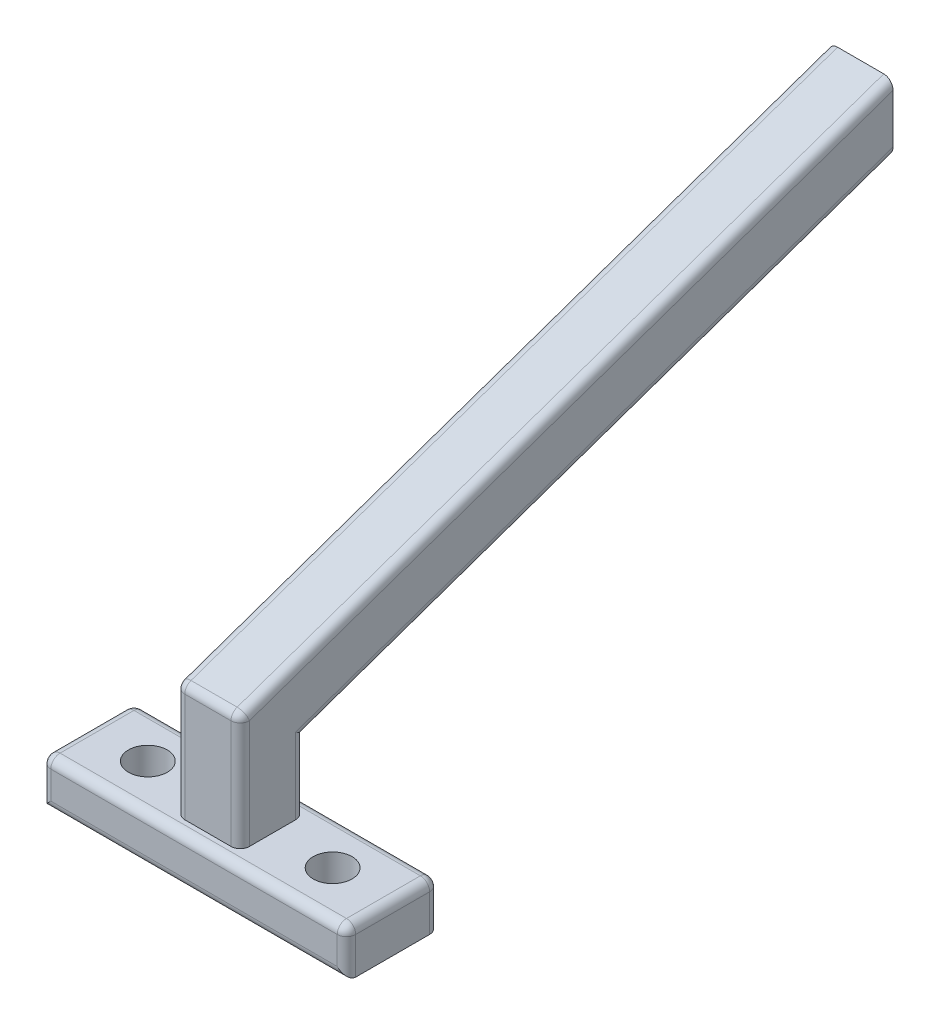
ISO-10303-21;
HEADER;
FILE_DESCRIPTION(('STEP AP214'),'2;1');
FILE_NAME('part.step','',(''),(''),'','','');
FILE_SCHEMA(('AUTOMOTIVE_DESIGN { 1 0 10303 214 1 1 1 1 }'));
ENDSEC;
DATA;
#1=APPLICATION_CONTEXT('core data for automotive mechanical design processes');
#2=APPLICATION_PROTOCOL_DEFINITION('international standard','automotive_design',2000,#1);
#3=PRODUCT_CONTEXT('',#1,'mechanical');
#4=PRODUCT('Part','Part','',(#3));
#5=PRODUCT_RELATED_PRODUCT_CATEGORY('part','',(#4));
#6=PRODUCT_DEFINITION_FORMATION('','',#4);
#7=PRODUCT_DEFINITION_CONTEXT('part definition',#1,'design');
#8=PRODUCT_DEFINITION('design','',#6,#7);
#9=PRODUCT_DEFINITION_SHAPE('','',#8);
#10=(LENGTH_UNIT() NAMED_UNIT(*) SI_UNIT(.MILLI.,.METRE.));
#11=(NAMED_UNIT(*) PLANE_ANGLE_UNIT() SI_UNIT($,.RADIAN.));
#12=(NAMED_UNIT(*) SI_UNIT($,.STERADIAN.) SOLID_ANGLE_UNIT());
#13=UNCERTAINTY_MEASURE_WITH_UNIT(LENGTH_MEASURE(1.E-05),#10,'distance_accuracy_value','');
#14=(GEOMETRIC_REPRESENTATION_CONTEXT(3) GLOBAL_UNCERTAINTY_ASSIGNED_CONTEXT((#13)) GLOBAL_UNIT_ASSIGNED_CONTEXT((#10,
#11,#12)) REPRESENTATION_CONTEXT('',''));
#15=CARTESIAN_POINT('',(0.,0.,0.));
#16=DIRECTION('',(0.,0.,1.));
#17=DIRECTION('',(1.,0.,0.));
#18=AXIS2_PLACEMENT_3D('',#15,#16,#17);
#19=CARTESIAN_POINT('',(7.,0.,10.));
#20=DIRECTION('',(0.,0.,-1.));
#21=DIRECTION('',(0.,1.,0.));
#22=AXIS2_PLACEMENT_3D('',#19,#20,#21);
#23=PLANE('',#22);
#24=DIRECTION('',(-1.,0.,0.));
#25=VECTOR('',#24,1.);
#26=CARTESIAN_POINT('',(20.,-4.,10.));
#27=LINE('',#26,#25);
#28=CARTESIAN_POINT('',(-12.,-4.,10.));
#29=VERTEX_POINT('',#28);
#30=CARTESIAN_POINT('',(19.,-4.,10.));
#31=VERTEX_POINT('',#30);
#32=EDGE_CURVE('E311',#29,#31,#27,.F.);
#33=ORIENTED_EDGE('',*,*,#32,.T.);
#34=DIRECTION('',(0.,-1.,0.));
#35=VECTOR('',#34,1.);
#36=CARTESIAN_POINT('',(19.,0.,10.));
#37=LINE('',#36,#35);
#38=CARTESIAN_POINT('',(19.,-1.,10.));
#39=VERTEX_POINT('',#38);
#40=EDGE_CURVE('E209',#31,#39,#37,.F.);
#41=ORIENTED_EDGE('',*,*,#40,.T.);
#42=DIRECTION('',(-1.,0.,0.));
#43=VECTOR('',#42,1.);
#44=CARTESIAN_POINT('',(7.,-1.,10.));
#45=LINE('',#44,#43);
#46=CARTESIAN_POINT('',(-12.,-1.,10.));
#47=VERTEX_POINT('',#46);
#48=EDGE_CURVE('E238',#39,#47,#45,.T.);
#49=ORIENTED_EDGE('',*,*,#48,.T.);
#50=DIRECTION('',(0.,-1.,0.));
#51=VECTOR('',#50,1.);
#52=CARTESIAN_POINT('',(-12.,-5.,10.));
#53=LINE('',#52,#51);
#54=EDGE_CURVE('E308',#47,#29,#53,.T.);
#55=ORIENTED_EDGE('',*,*,#54,.T.);
#56=EDGE_LOOP('',(#33,#41,#49,#55));
#57=FACE_BOUND('',#56,.T.);
#58=ADVANCED_FACE('F45',(#57),#23,.F.);
#59=CARTESIAN_POINT('',(7.,-5.,0.));
#60=DIRECTION('',(0.,-1.,0.));
#61=DIRECTION('',(0.,0.,-1.));
#62=AXIS2_PLACEMENT_3D('',#59,#60,#61);
#63=PLANE('',#62);
#64=CARTESIAN_POINT('',(-6.5,-5.,5.));
#65=DIRECTION('',(0.,-1.,0.));
#66=DIRECTION('',(0.,0.,-1.));
#67=AXIS2_PLACEMENT_3D('',#64,#65,#66);
#68=CIRCLE('',#67,2.1);
#69=CARTESIAN_POINT('',(-6.5,-5.,2.9));
#70=VERTEX_POINT('',#69);
#71=EDGE_CURVE('E300',#70,#70,#68,.T.);
#72=ORIENTED_EDGE('',*,*,#71,.F.);
#73=EDGE_LOOP('',(#72));
#74=FACE_BOUND('',#73,.T.);
#75=CARTESIAN_POINT('',(13.5,-5.,5.));
#76=DIRECTION('',(0.,-1.,0.));
#77=DIRECTION('',(0.,0.,-1.));
#78=AXIS2_PLACEMENT_3D('',#75,#76,#77);
#79=CIRCLE('',#78,2.1);
#80=CARTESIAN_POINT('',(13.5,-5.,2.9));
#81=VERTEX_POINT('',#80);
#82=EDGE_CURVE('E257',#81,#81,#79,.T.);
#83=ORIENTED_EDGE('',*,*,#82,.F.);
#84=EDGE_LOOP('',(#83));
#85=FACE_BOUND('',#84,.T.);
#86=DIRECTION('',(0.,0.,-1.));
#87=VECTOR('',#86,1.);
#88=CARTESIAN_POINT('',(20.,-5.,0.));
#89=LINE('',#88,#87);
#90=CARTESIAN_POINT('',(20.,-5.,9.));
#91=VERTEX_POINT('',#90);
#92=CARTESIAN_POINT('',(20.,-5.,1.));
#93=VERTEX_POINT('',#92);
#94=EDGE_CURVE('E232',#91,#93,#89,.T.);
#95=ORIENTED_EDGE('',*,*,#94,.F.);
#96=DIRECTION('',(-1.,0.,0.));
#97=VECTOR('',#96,1.);
#98=CARTESIAN_POINT('',(-13.,-5.,9.));
#99=LINE('',#98,#97);
#100=CARTESIAN_POINT('',(-13.,-5.,9.));
#101=VERTEX_POINT('',#100);
#102=EDGE_CURVE('E217',#91,#101,#99,.T.);
#103=ORIENTED_EDGE('',*,*,#102,.T.);
#104=DIRECTION('',(0.,0.,-1.));
#105=VECTOR('',#104,1.);
#106=CARTESIAN_POINT('',(-13.,-5.,0.));
#107=LINE('',#106,#105);
#108=CARTESIAN_POINT('',(-13.,-5.,1.));
#109=VERTEX_POINT('',#108);
#110=EDGE_CURVE('E246',#101,#109,#107,.T.);
#111=ORIENTED_EDGE('',*,*,#110,.T.);
#112=CARTESIAN_POINT('',(-12.,-5.,1.));
#113=DIRECTION('',(0.,-1.,0.));
#114=DIRECTION('',(0.,0.,-1.));
#115=AXIS2_PLACEMENT_3D('',#112,#113,#114);
#116=CIRCLE('',#115,1.);
#117=CARTESIAN_POINT('',(-12.,-5.,0.));
#118=VERTEX_POINT('',#117);
#119=EDGE_CURVE('E227',#109,#118,#116,.T.);
#120=ORIENTED_EDGE('',*,*,#119,.T.);
#121=DIRECTION('',(-1.,0.,0.));
#122=VECTOR('',#121,1.);
#123=CARTESIAN_POINT('',(7.,-5.,0.));
#124=LINE('',#123,#122);
#125=CARTESIAN_POINT('',(19.,-5.,0.));
#126=VERTEX_POINT('',#125);
#127=EDGE_CURVE('E291',#126,#118,#124,.T.);
#128=ORIENTED_EDGE('',*,*,#127,.F.);
#129=CARTESIAN_POINT('',(19.,-5.,1.));
#130=DIRECTION('',(0.,-1.,0.));
#131=DIRECTION('',(0.,0.,-1.));
#132=AXIS2_PLACEMENT_3D('',#129,#130,#131);
#133=CIRCLE('',#132,1.);
#134=EDGE_CURVE('E244',#126,#93,#133,.T.);
#135=ORIENTED_EDGE('',*,*,#134,.T.);
#136=EDGE_LOOP('',(#95,#103,#111,#120,#128,#135));
#137=FACE_BOUND('',#136,.T.);
#138=ADVANCED_FACE('F241',(#74,#85,#137),#63,.T.);
#139=CARTESIAN_POINT('',(7.,0.,0.));
#140=DIRECTION('',(0.,0.,-1.));
#141=DIRECTION('',(-1.,0.,0.));
#142=AXIS2_PLACEMENT_3D('',#139,#140,#141);
#143=PLANE('',#142);
#144=ORIENTED_EDGE('',*,*,#127,.T.);
#145=DIRECTION('',(0.,1.,0.));
#146=VECTOR('',#145,1.);
#147=CARTESIAN_POINT('',(-12.,0.,0.));
#148=LINE('',#147,#146);
#149=CARTESIAN_POINT('',(-12.,-1.,0.));
#150=VERTEX_POINT('',#149);
#151=EDGE_CURVE('E68',#118,#150,#148,.T.);
#152=ORIENTED_EDGE('',*,*,#151,.T.);
#153=DIRECTION('',(-1.,0.,0.));
#154=VECTOR('',#153,1.);
#155=CARTESIAN_POINT('',(20.,-1.,0.));
#156=LINE('',#155,#154);
#157=CARTESIAN_POINT('',(19.,-1.,0.));
#158=VERTEX_POINT('',#157);
#159=EDGE_CURVE('E63',#150,#158,#156,.F.);
#160=ORIENTED_EDGE('',*,*,#159,.T.);
#161=DIRECTION('',(0.,1.,0.));
#162=VECTOR('',#161,1.);
#163=CARTESIAN_POINT('',(19.,-5.,0.));
#164=LINE('',#163,#162);
#165=EDGE_CURVE('E412',#158,#126,#164,.F.);
#166=ORIENTED_EDGE('',*,*,#165,.T.);
#167=EDGE_LOOP('',(#144,#152,#160,#166));
#168=FACE_BOUND('',#167,.T.);
#169=ADVANCED_FACE('F583',(#168),#143,.T.);
#170=CARTESIAN_POINT('',(7.,0.,0.));
#171=DIRECTION('',(0.,-1.,0.));
#172=DIRECTION('',(0.,0.,-1.));
#173=AXIS2_PLACEMENT_3D('',#170,#171,#172);
#174=PLANE('',#173);
#175=DIRECTION('',(0.,0.,1.));
#176=VECTOR('',#175,1.);
#177=CARTESIAN_POINT('',(-12.,0.,10.));
#178=LINE('',#177,#176);
#179=CARTESIAN_POINT('',(-12.,0.,1.));
#180=VERTEX_POINT('',#179);
#181=CARTESIAN_POINT('',(-12.,0.,9.));
#182=VERTEX_POINT('',#181);
#183=EDGE_CURVE('E334',#180,#182,#178,.T.);
#184=ORIENTED_EDGE('',*,*,#183,.T.);
#185=DIRECTION('',(-1.,0.,0.));
#186=VECTOR('',#185,1.);
#187=CARTESIAN_POINT('',(7.,0.,9.));
#188=LINE('',#187,#186);
#189=CARTESIAN_POINT('',(19.,0.,9.));
#190=VERTEX_POINT('',#189);
#191=EDGE_CURVE('E337',#182,#190,#188,.F.);
#192=ORIENTED_EDGE('',*,*,#191,.T.);
#193=DIRECTION('',(0.,0.,1.));
#194=VECTOR('',#193,1.);
#195=CARTESIAN_POINT('',(19.,0.,0.));
#196=LINE('',#195,#194);
#197=CARTESIAN_POINT('',(19.,0.,1.));
#198=VERTEX_POINT('',#197);
#199=EDGE_CURVE('E328',#190,#198,#196,.F.);
#200=ORIENTED_EDGE('',*,*,#199,.T.);
#201=DIRECTION('',(-1.,0.,0.));
#202=VECTOR('',#201,1.);
#203=CARTESIAN_POINT('',(-13.,0.,1.));
#204=LINE('',#203,#202);
#205=EDGE_CURVE('E331',#198,#180,#204,.T.);
#206=ORIENTED_EDGE('',*,*,#205,.T.);
#207=EDGE_LOOP('',(#184,#192,#200,#206));
#208=FACE_BOUND('',#207,.T.);
#209=CARTESIAN_POINT('',(-6.5,0.,5.));
#210=DIRECTION('',(0.,-1.,0.));
#211=DIRECTION('',(0.,0.,-1.));
#212=AXIS2_PLACEMENT_3D('',#209,#210,#211);
#213=CIRCLE('',#212,2.1);
#214=CARTESIAN_POINT('',(-6.5,0.,2.9));
#215=VERTEX_POINT('',#214);
#216=EDGE_CURVE('E247',#215,#215,#213,.T.);
#217=ORIENTED_EDGE('',*,*,#216,.T.);
#218=EDGE_LOOP('',(#217));
#219=FACE_BOUND('',#218,.T.);
#220=CARTESIAN_POINT('',(13.5,0.,5.));
#221=DIRECTION('',(0.,-1.,0.));
#222=DIRECTION('',(0.,0.,-1.));
#223=AXIS2_PLACEMENT_3D('',#220,#221,#222);
#224=CIRCLE('',#223,2.1);
#225=CARTESIAN_POINT('',(13.5,0.,2.9));
#226=VERTEX_POINT('',#225);
#227=EDGE_CURVE('E254',#226,#226,#224,.T.);
#228=ORIENTED_EDGE('',*,*,#227,.T.);
#229=EDGE_LOOP('',(#228));
#230=FACE_BOUND('',#229,.T.);
#231=DIRECTION('',(-1.,0.,0.));
#232=VECTOR('',#231,1.);
#233=CARTESIAN_POINT('',(7.,0.,1.5));
#234=LINE('',#233,#232);
#235=CARTESIAN_POINT('',(6.,0.,1.5));
#236=VERTEX_POINT('',#235);
#237=CARTESIAN_POINT('',(1.,0.,1.5));
#238=VERTEX_POINT('',#237);
#239=EDGE_CURVE('E287',#236,#238,#234,.T.);
#240=ORIENTED_EDGE('',*,*,#239,.F.);
#241=CARTESIAN_POINT('',(6.,0.,2.5));
#242=DIRECTION('',(0.,-1.,0.));
#243=DIRECTION('',(0.,0.,-1.));
#244=AXIS2_PLACEMENT_3D('',#241,#242,#243);
#245=CIRCLE('',#244,1.);
#246=CARTESIAN_POINT('',(7.,0.,2.5));
#247=VERTEX_POINT('',#246);
#248=EDGE_CURVE('E417',#236,#247,#245,.T.);
#249=ORIENTED_EDGE('',*,*,#248,.T.);
#250=DIRECTION('',(0.,0.,1.));
#251=VECTOR('',#250,1.);
#252=CARTESIAN_POINT('',(7.,0.,0.));
#253=LINE('',#252,#251);
#254=CARTESIAN_POINT('',(7.,0.,7.5));
#255=VERTEX_POINT('',#254);
#256=EDGE_CURVE('E251',#247,#255,#253,.T.);
#257=ORIENTED_EDGE('',*,*,#256,.T.);
#258=CARTESIAN_POINT('',(6.,0.,7.5));
#259=DIRECTION('',(0.,-1.,0.));
#260=DIRECTION('',(0.,0.,-1.));
#261=AXIS2_PLACEMENT_3D('',#258,#259,#260);
#262=CIRCLE('',#261,1.);
#263=CARTESIAN_POINT('',(6.,0.,8.5));
#264=VERTEX_POINT('',#263);
#265=EDGE_CURVE('E55',#255,#264,#262,.T.);
#266=ORIENTED_EDGE('',*,*,#265,.T.);
#267=DIRECTION('',(-1.,0.,0.));
#268=VECTOR('',#267,1.);
#269=CARTESIAN_POINT('',(7.,0.,8.5));
#270=LINE('',#269,#268);
#271=CARTESIAN_POINT('',(1.,0.,8.5));
#272=VERTEX_POINT('',#271);
#273=EDGE_CURVE('E268',#264,#272,#270,.T.);
#274=ORIENTED_EDGE('',*,*,#273,.T.);
#275=CARTESIAN_POINT('',(1.,0.,7.5));
#276=DIRECTION('',(0.,-1.,0.));
#277=DIRECTION('',(0.,0.,-1.));
#278=AXIS2_PLACEMENT_3D('',#275,#276,#277);
#279=CIRCLE('',#278,1.);
#280=CARTESIAN_POINT('',(0.,0.,7.5));
#281=VERTEX_POINT('',#280);
#282=EDGE_CURVE('E11',#272,#281,#279,.T.);
#283=ORIENTED_EDGE('',*,*,#282,.T.);
#284=DIRECTION('',(0.,0.,1.));
#285=VECTOR('',#284,1.);
#286=CARTESIAN_POINT('',(0.,0.,0.));
#287=LINE('',#286,#285);
#288=CARTESIAN_POINT('',(0.,0.,2.5));
#289=VERTEX_POINT('',#288);
#290=EDGE_CURVE('E294',#289,#281,#287,.T.);
#291=ORIENTED_EDGE('',*,*,#290,.F.);
#292=CARTESIAN_POINT('',(1.,0.,2.5));
#293=DIRECTION('',(0.,-1.,0.));
#294=DIRECTION('',(0.,0.,-1.));
#295=AXIS2_PLACEMENT_3D('',#292,#293,#294);
#296=CIRCLE('',#295,1.);
#297=EDGE_CURVE('E420',#289,#238,#296,.T.);
#298=ORIENTED_EDGE('',*,*,#297,.T.);
#299=EDGE_LOOP('',(#240,#249,#257,#266,#274,#283,#291,#298));
#300=FACE_BOUND('',#299,.T.);
#301=ADVANCED_FACE('F547',(#208,#219,#230,#300),#174,.F.);
#302=CARTESIAN_POINT('',(7.,0.,1.5));
#303=DIRECTION('',(0.,0.,1.));
#304=DIRECTION('',(1.,0.,0.));
#305=AXIS2_PLACEMENT_3D('',#302,#303,#304);
#306=PLANE('',#305);
#307=DIRECTION('',(-1.,0.,0.));
#308=VECTOR('',#307,1.);
#309=CARTESIAN_POINT('',(7.,7.51262313800513,1.5));
#310=LINE('',#309,#308);
#311=CARTESIAN_POINT('',(6.,7.51262313800513,1.5));
#312=VERTEX_POINT('',#311);
#313=CARTESIAN_POINT('',(1.,7.51262313800513,1.5));
#314=VERTEX_POINT('',#313);
#315=EDGE_CURVE('E283',#312,#314,#310,.T.);
#316=ORIENTED_EDGE('',*,*,#315,.F.);
#317=DIRECTION('',(0.,1.,0.));
#318=VECTOR('',#317,1.);
#319=CARTESIAN_POINT('',(6.,0.,1.5));
#320=LINE('',#319,#318);
#321=EDGE_CURVE('E357',#312,#236,#320,.F.);
#322=ORIENTED_EDGE('',*,*,#321,.T.);
#323=ORIENTED_EDGE('',*,*,#239,.T.);
#324=DIRECTION('',(0.,1.,0.));
#325=VECTOR('',#324,1.);
#326=CARTESIAN_POINT('',(1.,0.,1.5));
#327=LINE('',#326,#325);
#328=EDGE_CURVE('E354',#238,#314,#327,.T.);
#329=ORIENTED_EDGE('',*,*,#328,.T.);
#330=EDGE_LOOP('',(#316,#322,#323,#329));
#331=FACE_BOUND('',#330,.T.);
#332=ADVANCED_FACE('F575',(#331),#306,.F.);
#333=CARTESIAN_POINT('',(7.,7.51262313800513,1.5));
#334=DIRECTION('',(0.,0.944383403386701,0.328846449589701));
#335=DIRECTION('',(0.,-0.328846449589701,0.944383403386701));
#336=AXIS2_PLACEMENT_3D('',#333,#334,#335);
#337=PLANE('',#336);
#338=DIRECTION('',(-1.,0.,0.));
#339=VECTOR('',#338,1.);
#340=CARTESIAN_POINT('',(7.,29.6763719304156,-62.15));
#341=LINE('',#340,#339);
#342=CARTESIAN_POINT('',(6.,29.6763719304156,-62.15));
#343=VERTEX_POINT('',#342);
#344=CARTESIAN_POINT('',(1.,29.6763719304156,-62.15));
#345=VERTEX_POINT('',#344);
#346=EDGE_CURVE('E279',#343,#345,#341,.T.);
#347=ORIENTED_EDGE('',*,*,#346,.F.);
#348=DIRECTION('',(0.,0.328846449589701,-0.944383403386701));
#349=VECTOR('',#348,1.);
#350=CARTESIAN_POINT('',(6.,7.51262313800513,1.5));
#351=LINE('',#350,#349);
#352=EDGE_CURVE('E376',#343,#312,#351,.F.);
#353=ORIENTED_EDGE('',*,*,#352,.T.);
#354=ORIENTED_EDGE('',*,*,#315,.T.);
#355=DIRECTION('',(0.,0.328846449589701,-0.944383403386701));
#356=VECTOR('',#355,1.);
#357=CARTESIAN_POINT('',(1.,7.51262313800513,1.5));
#358=LINE('',#357,#356);
#359=EDGE_CURVE('E372',#314,#345,#358,.T.);
#360=ORIENTED_EDGE('',*,*,#359,.T.);
#361=EDGE_LOOP('',(#347,#353,#354,#360));
#362=FACE_BOUND('',#361,.T.);
#363=ADVANCED_FACE('F533',(#362),#337,.F.);
#364=CARTESIAN_POINT('',(7.,29.6763719304156,-62.15));
#365=DIRECTION('',(0.,0.,1.));
#366=DIRECTION('',(0.,-1.,0.));
#367=AXIS2_PLACEMENT_3D('',#364,#365,#366);
#368=PLANE('',#367);
#369=DIRECTION('',(0.,1.,0.));
#370=VECTOR('',#369,1.);
#371=CARTESIAN_POINT('',(7.,29.6763719304156,-62.15));
#372=LINE('',#371,#370);
#373=CARTESIAN_POINT('',(7.,30.7352638978241,-62.15));
#374=VERTEX_POINT('',#373);
#375=CARTESIAN_POINT('',(7.,36.0297237348661,-62.15));
#376=VERTEX_POINT('',#375);
#377=EDGE_CURVE('E264',#374,#376,#372,.T.);
#378=ORIENTED_EDGE('',*,*,#377,.F.);
#379=CARTESIAN_POINT('',(6.,30.7352638978241,-62.15));
#380=DIRECTION('',(0.,0.,1.));
#381=DIRECTION('',(0.,-1.,0.));
#382=AXIS2_PLACEMENT_3D('',#379,#380,#381);
#383=ELLIPSE('',#382,1.05889196740842,1.);
#384=EDGE_CURVE('E369',#374,#343,#383,.F.);
#385=ORIENTED_EDGE('',*,*,#384,.T.);
#386=ORIENTED_EDGE('',*,*,#346,.T.);
#387=CARTESIAN_POINT('',(1.,30.735263897824,-62.15));
#388=DIRECTION('',(0.,0.,1.));
#389=DIRECTION('',(0.,1.,0.));
#390=AXIS2_PLACEMENT_3D('',#387,#388,#389);
#391=ELLIPSE('',#390,1.05889196740842,1.);
#392=CARTESIAN_POINT('',(0.,30.7352638978241,-62.15));
#393=VERTEX_POINT('',#392);
#394=EDGE_CURVE('E360',#345,#393,#391,.F.);
#395=ORIENTED_EDGE('',*,*,#394,.T.);
#396=DIRECTION('',(0.,1.,0.));
#397=VECTOR('',#396,1.);
#398=CARTESIAN_POINT('',(0.,29.6763719304156,-62.15));
#399=LINE('',#398,#397);
#400=CARTESIAN_POINT('',(0.,36.0297237348661,-62.15));
#401=VERTEX_POINT('',#400);
#402=EDGE_CURVE('E263',#393,#401,#399,.T.);
#403=ORIENTED_EDGE('',*,*,#402,.T.);
#404=CARTESIAN_POINT('',(1.,36.0297237348661,-62.15));
#405=DIRECTION('',(0.,0.,1.));
#406=DIRECTION('',(0.,-1.,0.));
#407=AXIS2_PLACEMENT_3D('',#404,#405,#406);
#408=ELLIPSE('',#407,1.05889196740842,1.);
#409=CARTESIAN_POINT('',(1.,37.0886157022746,-62.15));
#410=VERTEX_POINT('',#409);
#411=EDGE_CURVE('E363',#401,#410,#408,.F.);
#412=ORIENTED_EDGE('',*,*,#411,.T.);
#413=DIRECTION('',(-1.,0.,0.));
#414=VECTOR('',#413,1.);
#415=CARTESIAN_POINT('',(7.,37.0886157022746,-62.15));
#416=LINE('',#415,#414);
#417=CARTESIAN_POINT('',(6.,37.0886157022746,-62.15));
#418=VERTEX_POINT('',#417);
#419=EDGE_CURVE('E275',#418,#410,#416,.T.);
#420=ORIENTED_EDGE('',*,*,#419,.F.);
#421=CARTESIAN_POINT('',(6.,36.0297237348661,-62.15));
#422=DIRECTION('',(0.,0.,1.));
#423=DIRECTION('',(0.,1.,0.));
#424=AXIS2_PLACEMENT_3D('',#421,#422,#423);
#425=ELLIPSE('',#424,1.05889196740842,1.);
#426=EDGE_CURVE('E366',#418,#376,#425,.F.);
#427=ORIENTED_EDGE('',*,*,#426,.T.);
#428=EDGE_LOOP('',(#378,#385,#386,#395,#403,#412,#420,#427));
#429=FACE_BOUND('',#428,.T.);
#430=ADVANCED_FACE('F526',(#429),#368,.F.);
#431=CARTESIAN_POINT('',(7.,12.4873768619949,8.5));
#432=DIRECTION('',(0.,0.944383403386701,0.328846449589701));
#433=DIRECTION('',(0.,-0.328846449589701,0.944383403386701));
#434=AXIS2_PLACEMENT_3D('',#431,#432,#433);
#435=PLANE('',#434);
#436=DIRECTION('',(-1.,0.,0.));
#437=VECTOR('',#436,1.);
#438=CARTESIAN_POINT('',(7.,12.7210811619545,7.8288464495897));
#439=LINE('',#438,#437);
#440=CARTESIAN_POINT('',(1.,12.7210811619545,7.8288464495897));
#441=VERTEX_POINT('',#440);
#442=CARTESIAN_POINT('',(6.,12.7210811619545,7.8288464495897));
#443=VERTEX_POINT('',#442);
#444=EDGE_CURVE('E379',#441,#443,#439,.F.);
#445=ORIENTED_EDGE('',*,*,#444,.T.);
#446=DIRECTION('',(0.,0.328846449589701,-0.944383403386701));
#447=VECTOR('',#446,1.);
#448=CARTESIAN_POINT('',(6.,12.4873768619949,8.5));
#449=LINE('',#448,#447);
#450=EDGE_CURVE('E385',#443,#418,#449,.T.);
#451=ORIENTED_EDGE('',*,*,#450,.T.);
#452=ORIENTED_EDGE('',*,*,#419,.T.);
#453=DIRECTION('',(0.,0.328846449589701,-0.944383403386701));
#454=VECTOR('',#453,1.);
#455=CARTESIAN_POINT('',(1.,12.4873768619949,8.5));
#456=LINE('',#455,#454);
#457=EDGE_CURVE('E382',#410,#441,#456,.F.);
#458=ORIENTED_EDGE('',*,*,#457,.T.);
#459=EDGE_LOOP('',(#445,#451,#452,#458));
#460=FACE_BOUND('',#459,.T.);
#461=ADVANCED_FACE('F512',(#460),#435,.T.);
#462=CARTESIAN_POINT('',(7.,0.,8.5));
#463=DIRECTION('',(0.,0.,1.));
#464=DIRECTION('',(1.,0.,0.));
#465=AXIS2_PLACEMENT_3D('',#462,#463,#464);
#466=PLANE('',#465);
#467=ORIENTED_EDGE('',*,*,#273,.F.);
#468=DIRECTION('',(0.,1.,0.));
#469=VECTOR('',#468,1.);
#470=CARTESIAN_POINT('',(6.,0.,8.5));
#471=LINE('',#470,#469);
#472=CARTESIAN_POINT('',(6.,11.7766977585678,8.5));
#473=VERTEX_POINT('',#472);
#474=EDGE_CURVE('E407',#264,#473,#471,.T.);
#475=ORIENTED_EDGE('',*,*,#474,.T.);
#476=DIRECTION('',(-1.,0.,0.));
#477=VECTOR('',#476,1.);
#478=CARTESIAN_POINT('',(7.,11.7766977585678,8.5));
#479=LINE('',#478,#477);
#480=CARTESIAN_POINT('',(1.,11.7766977585678,8.5));
#481=VERTEX_POINT('',#480);
#482=EDGE_CURVE('E404',#473,#481,#479,.T.);
#483=ORIENTED_EDGE('',*,*,#482,.T.);
#484=DIRECTION('',(0.,1.,0.));
#485=VECTOR('',#484,1.);
#486=CARTESIAN_POINT('',(1.,0.,8.5));
#487=LINE('',#486,#485);
#488=EDGE_CURVE('E401',#481,#272,#487,.F.);
#489=ORIENTED_EDGE('',*,*,#488,.T.);
#490=EDGE_LOOP('',(#467,#475,#483,#489));
#491=FACE_BOUND('',#490,.T.);
#492=ADVANCED_FACE('F552',(#491),#466,.T.);
#493=CARTESIAN_POINT('',(7.,0.,0.));
#494=DIRECTION('',(1.,0.,0.));
#495=DIRECTION('',(0.,0.,-1.));
#496=AXIS2_PLACEMENT_3D('',#493,#494,#495);
#497=PLANE('',#496);
#498=ORIENTED_EDGE('',*,*,#256,.F.);
#499=DIRECTION('',(0.,1.,0.));
#500=VECTOR('',#499,1.);
#501=CARTESIAN_POINT('',(7.,7.51262313800513,2.5));
#502=LINE('',#501,#500);
#503=CARTESIAN_POINT('',(7.,8.22330224143225,2.5));
#504=VERTEX_POINT('',#503);
#505=EDGE_CURVE('E350',#247,#504,#502,.T.);
#506=ORIENTED_EDGE('',*,*,#505,.T.);
#507=DIRECTION('',(0.,0.328846449589701,-0.944383403386701));
#508=VECTOR('',#507,1.);
#509=CARTESIAN_POINT('',(7.,30.6207553338023,-61.8211535504103));
#510=LINE('',#509,#508);
#511=EDGE_CURVE('E347',#504,#374,#510,.T.);
#512=ORIENTED_EDGE('',*,*,#511,.T.);
#513=ORIENTED_EDGE('',*,*,#377,.T.);
#514=DIRECTION('',(0.,0.328846449589701,-0.944383403386701));
#515=VECTOR('',#514,1.);
#516=CARTESIAN_POINT('',(7.,12.832344280665,4.46838735356457));
#517=LINE('',#516,#515);
#518=CARTESIAN_POINT('',(7.,11.7766977585678,7.5));
#519=VERTEX_POINT('',#518);
#520=EDGE_CURVE('E344',#376,#519,#517,.F.);
#521=ORIENTED_EDGE('',*,*,#520,.T.);
#522=DIRECTION('',(0.,1.,0.));
#523=VECTOR('',#522,1.);
#524=CARTESIAN_POINT('',(7.,0.,7.5));
#525=LINE('',#524,#523);
#526=EDGE_CURVE('E341',#519,#255,#525,.F.);
#527=ORIENTED_EDGE('',*,*,#526,.T.);
#528=EDGE_LOOP('',(#498,#506,#512,#513,#521,#527));
#529=FACE_BOUND('',#528,.T.);
#530=ADVANCED_FACE('F566',(#529),#497,.T.);
#531=CARTESIAN_POINT('',(0.,0.,0.));
#532=DIRECTION('',(1.,0.,0.));
#533=DIRECTION('',(0.,0.,-1.));
#534=AXIS2_PLACEMENT_3D('',#531,#532,#533);
#535=PLANE('',#534);
#536=ORIENTED_EDGE('',*,*,#402,.F.);
#537=DIRECTION('',(0.,0.328846449589701,-0.944383403386701));
#538=VECTOR('',#537,1.);
#539=CARTESIAN_POINT('',(0.,8.11042726373151,2.82415510561606));
#540=LINE('',#539,#538);
#541=CARTESIAN_POINT('',(0.,8.22330224143224,2.5));
#542=VERTEX_POINT('',#541);
#543=EDGE_CURVE('E398',#393,#542,#540,.F.);
#544=ORIENTED_EDGE('',*,*,#543,.T.);
#545=DIRECTION('',(0.,1.,0.));
#546=VECTOR('',#545,1.);
#547=CARTESIAN_POINT('',(0.,0.,2.5));
#548=LINE('',#547,#546);
#549=EDGE_CURVE('E395',#542,#289,#548,.F.);
#550=ORIENTED_EDGE('',*,*,#549,.T.);
#551=ORIENTED_EDGE('',*,*,#290,.T.);
#552=DIRECTION('',(0.,1.,0.));
#553=VECTOR('',#552,1.);
#554=CARTESIAN_POINT('',(0.,12.4873768619949,7.5));
#555=LINE('',#554,#553);
#556=CARTESIAN_POINT('',(0.,11.7766977585678,7.5));
#557=VERTEX_POINT('',#556);
#558=EDGE_CURVE('E389',#281,#557,#555,.T.);
#559=ORIENTED_EDGE('',*,*,#558,.T.);
#560=DIRECTION('',(0.,0.328846449589701,-0.944383403386701));
#561=VECTOR('',#560,1.);
#562=CARTESIAN_POINT('',(0.,36.1442322988879,-62.4788464495897));
#563=LINE('',#562,#561);
#564=EDGE_CURVE('E392',#557,#401,#563,.T.);
#565=ORIENTED_EDGE('',*,*,#564,.T.);
#566=EDGE_LOOP('',(#536,#544,#550,#551,#559,#565));
#567=FACE_BOUND('',#566,.T.);
#568=ADVANCED_FACE('F522',(#567),#535,.F.);
#569=CARTESIAN_POINT('',(-13.,0.,0.));
#570=DIRECTION('',(-1.,0.,0.));
#571=DIRECTION('',(0.,0.,1.));
#572=AXIS2_PLACEMENT_3D('',#569,#570,#571);
#573=PLANE('',#572);
#574=ORIENTED_EDGE('',*,*,#110,.F.);
#575=DIRECTION('',(0.,-1.,0.));
#576=VECTOR('',#575,1.);
#577=CARTESIAN_POINT('',(-13.,0.,9.));
#578=LINE('',#577,#576);
#579=CARTESIAN_POINT('',(-13.,-1.,9.));
#580=VERTEX_POINT('',#579);
#581=EDGE_CURVE('E325',#101,#580,#578,.F.);
#582=ORIENTED_EDGE('',*,*,#581,.T.);
#583=DIRECTION('',(0.,0.,1.));
#584=VECTOR('',#583,1.);
#585=CARTESIAN_POINT('',(-13.,-1.,0.));
#586=LINE('',#585,#584);
#587=CARTESIAN_POINT('',(-13.,-1.,1.));
#588=VERTEX_POINT('',#587);
#589=EDGE_CURVE('E322',#580,#588,#586,.F.);
#590=ORIENTED_EDGE('',*,*,#589,.T.);
#591=DIRECTION('',(0.,1.,0.));
#592=VECTOR('',#591,1.);
#593=CARTESIAN_POINT('',(-13.,0.,1.));
#594=LINE('',#593,#592);
#595=EDGE_CURVE('E226',#588,#109,#594,.F.);
#596=ORIENTED_EDGE('',*,*,#595,.T.);
#597=EDGE_LOOP('',(#574,#582,#590,#596));
#598=FACE_BOUND('',#597,.T.);
#599=ADVANCED_FACE('F788',(#598),#573,.T.);
#600=CARTESIAN_POINT('',(20.,0.,0.));
#601=DIRECTION('',(-1.,0.,0.));
#602=DIRECTION('',(0.,0.,1.));
#603=AXIS2_PLACEMENT_3D('',#600,#601,#602);
#604=PLANE('',#603);
#605=DIRECTION('',(0.,0.,1.));
#606=VECTOR('',#605,1.);
#607=CARTESIAN_POINT('',(20.,-1.,0.));
#608=LINE('',#607,#606);
#609=CARTESIAN_POINT('',(20.,-1.,1.));
#610=VERTEX_POINT('',#609);
#611=CARTESIAN_POINT('',(20.,-1.,9.));
#612=VERTEX_POINT('',#611);
#613=EDGE_CURVE('E235',#610,#612,#608,.T.);
#614=ORIENTED_EDGE('',*,*,#613,.T.);
#615=DIRECTION('',(0.,-1.,0.));
#616=VECTOR('',#615,1.);
#617=CARTESIAN_POINT('',(20.,0.,9.));
#618=LINE('',#617,#616);
#619=EDGE_CURVE('E207',#612,#91,#618,.T.);
#620=ORIENTED_EDGE('',*,*,#619,.T.);
#621=ORIENTED_EDGE('',*,*,#94,.T.);
#622=DIRECTION('',(0.,1.,0.));
#623=VECTOR('',#622,1.);
#624=CARTESIAN_POINT('',(20.,0.,1.));
#625=LINE('',#624,#623);
#626=EDGE_CURVE('E239',#93,#610,#625,.T.);
#627=ORIENTED_EDGE('',*,*,#626,.T.);
#628=EDGE_LOOP('',(#614,#620,#621,#627));
#629=FACE_BOUND('',#628,.T.);
#630=ADVANCED_FACE('F231',(#629),#604,.F.);
#631=CARTESIAN_POINT('',(13.5,37.0886157022746,5.));
#632=DIRECTION('',(0.,-1.,0.));
#633=DIRECTION('',(0.,0.,-1.));
#634=AXIS2_PLACEMENT_3D('',#631,#632,#633);
#635=CYLINDRICAL_SURFACE('',#634,2.1);
#636=ORIENTED_EDGE('',*,*,#82,.T.);
#637=EDGE_LOOP('',(#636));
#638=FACE_BOUND('',#637,.T.);
#639=ORIENTED_EDGE('',*,*,#227,.F.);
#640=EDGE_LOOP('',(#639));
#641=FACE_BOUND('',#640,.T.);
#642=ADVANCED_FACE('F787',(#638,#641),#635,.F.);
#643=CARTESIAN_POINT('',(-6.5,37.0886157022746,5.));
#644=DIRECTION('',(0.,-1.,0.));
#645=DIRECTION('',(0.,0.,-1.));
#646=AXIS2_PLACEMENT_3D('',#643,#644,#645);
#647=CYLINDRICAL_SURFACE('',#646,2.1);
#648=ORIENTED_EDGE('',*,*,#71,.T.);
#649=EDGE_LOOP('',(#648));
#650=FACE_BOUND('',#649,.T.);
#651=ORIENTED_EDGE('',*,*,#216,.F.);
#652=EDGE_LOOP('',(#651));
#653=FACE_BOUND('',#652,.T.);
#654=ADVANCED_FACE('F644',(#650,#653),#647,.F.);
#655=CARTESIAN_POINT('',(-12.,0.,1.));
#656=DIRECTION('',(0.,1.,0.));
#657=DIRECTION('',(0.,0.,1.));
#658=AXIS2_PLACEMENT_3D('',#655,#656,#657);
#659=CYLINDRICAL_SURFACE('',#658,1.);
#660=CARTESIAN_POINT('',(-12.,-1.,1.));
#661=DIRECTION('',(0.,1.,0.));
#662=DIRECTION('',(0.,0.,1.));
#663=AXIS2_PLACEMENT_3D('',#660,#661,#662);
#664=CIRCLE('',#663,1.);
#665=EDGE_CURVE('E468',#150,#588,#664,.T.);
#666=ORIENTED_EDGE('',*,*,#665,.F.);
#667=ORIENTED_EDGE('',*,*,#151,.F.);
#668=ORIENTED_EDGE('',*,*,#119,.F.);
#669=ORIENTED_EDGE('',*,*,#595,.F.);
#670=EDGE_LOOP('',(#666,#667,#668,#669));
#671=FACE_BOUND('',#670,.T.);
#672=ADVANCED_FACE('F640',(#671),#659,.T.);
#673=CARTESIAN_POINT('',(-12.,-1.,1.));
#674=DIRECTION('',(0.,0.,-1.));
#675=DIRECTION('',(-1.,0.,0.));
#676=AXIS2_PLACEMENT_3D('',#673,#674,#675);
#677=SPHERICAL_SURFACE('',#676,1.);
#678=CARTESIAN_POINT('',(-12.,-1.,1.));
#679=DIRECTION('',(0.,0.,-1.));
#680=DIRECTION('',(-1.,0.,0.));
#681=AXIS2_PLACEMENT_3D('',#678,#679,#680);
#682=CIRCLE('',#681,1.);
#683=EDGE_CURVE('E460',#180,#588,#682,.F.);
#684=ORIENTED_EDGE('',*,*,#683,.F.);
#685=CARTESIAN_POINT('',(-12.,-1.,1.));
#686=DIRECTION('',(-1.,0.,0.));
#687=DIRECTION('',(0.,0.,1.));
#688=AXIS2_PLACEMENT_3D('',#685,#686,#687);
#689=CIRCLE('',#688,1.);
#690=EDGE_CURVE('E464',#150,#180,#689,.F.);
#691=ORIENTED_EDGE('',*,*,#690,.F.);
#692=ORIENTED_EDGE('',*,*,#665,.T.);
#693=EDGE_LOOP('',(#684,#691,#692));
#694=FACE_BOUND('',#693,.T.);
#695=ADVANCED_FACE('F636',(#694),#677,.T.);
#696=CARTESIAN_POINT('',(7.,-1.,1.));
#697=DIRECTION('',(1.,0.,0.));
#698=DIRECTION('',(0.,0.,-1.));
#699=AXIS2_PLACEMENT_3D('',#696,#697,#698);
#700=CYLINDRICAL_SURFACE('',#699,1.);
#701=ORIENTED_EDGE('',*,*,#690,.T.);
#702=ORIENTED_EDGE('',*,*,#205,.F.);
#703=CARTESIAN_POINT('',(19.,-1.,1.));
#704=DIRECTION('',(1.,0.,0.));
#705=DIRECTION('',(0.,0.,-1.));
#706=AXIS2_PLACEMENT_3D('',#703,#704,#705);
#707=CIRCLE('',#706,1.);
#708=EDGE_CURVE('E456',#158,#198,#707,.T.);
#709=ORIENTED_EDGE('',*,*,#708,.F.);
#710=ORIENTED_EDGE('',*,*,#159,.F.);
#711=EDGE_LOOP('',(#701,#702,#709,#710));
#712=FACE_BOUND('',#711,.T.);
#713=ADVANCED_FACE('F632',(#712),#700,.T.);
#714=CARTESIAN_POINT('',(19.,0.,1.));
#715=DIRECTION('',(0.,-1.,0.));
#716=DIRECTION('',(0.,0.,-1.));
#717=AXIS2_PLACEMENT_3D('',#714,#715,#716);
#718=CYLINDRICAL_SURFACE('',#717,1.);
#719=ORIENTED_EDGE('',*,*,#134,.F.);
#720=ORIENTED_EDGE('',*,*,#165,.F.);
#721=CARTESIAN_POINT('',(19.,-1.,1.));
#722=DIRECTION('',(0.,1.,0.));
#723=DIRECTION('',(0.,0.,1.));
#724=AXIS2_PLACEMENT_3D('',#721,#722,#723);
#725=CIRCLE('',#724,1.);
#726=EDGE_CURVE('E452',#610,#158,#725,.T.);
#727=ORIENTED_EDGE('',*,*,#726,.F.);
#728=ORIENTED_EDGE('',*,*,#626,.F.);
#729=EDGE_LOOP('',(#719,#720,#727,#728));
#730=FACE_BOUND('',#729,.T.);
#731=ADVANCED_FACE('F628',(#730),#718,.T.);
#732=CARTESIAN_POINT('',(-12.,-1.,0.));
#733=DIRECTION('',(0.,0.,-1.));
#734=DIRECTION('',(0.,1.,0.));
#735=AXIS2_PLACEMENT_3D('',#732,#733,#734);
#736=CYLINDRICAL_SURFACE('',#735,1.);
#737=ORIENTED_EDGE('',*,*,#683,.T.);
#738=ORIENTED_EDGE('',*,*,#589,.F.);
#739=CARTESIAN_POINT('',(-12.,-1.,9.));
#740=DIRECTION('',(0.,0.,1.));
#741=DIRECTION('',(1.,0.,0.));
#742=AXIS2_PLACEMENT_3D('',#739,#740,#741);
#743=CIRCLE('',#742,1.);
#744=EDGE_CURVE('E448',#182,#580,#743,.T.);
#745=ORIENTED_EDGE('',*,*,#744,.F.);
#746=ORIENTED_EDGE('',*,*,#183,.F.);
#747=EDGE_LOOP('',(#737,#738,#745,#746));
#748=FACE_BOUND('',#747,.T.);
#749=ADVANCED_FACE('F624',(#748),#736,.T.);
#750=CARTESIAN_POINT('',(19.,-1.,1.));
#751=DIRECTION('',(0.,0.,-1.));
#752=DIRECTION('',(-1.,0.,0.));
#753=AXIS2_PLACEMENT_3D('',#750,#751,#752);
#754=SPHERICAL_SURFACE('',#753,1.);
#755=ORIENTED_EDGE('',*,*,#726,.T.);
#756=ORIENTED_EDGE('',*,*,#708,.T.);
#757=CARTESIAN_POINT('',(19.,-1.,1.));
#758=DIRECTION('',(0.,0.,-1.));
#759=DIRECTION('',(-1.,0.,0.));
#760=AXIS2_PLACEMENT_3D('',#757,#758,#759);
#761=CIRCLE('',#760,1.);
#762=EDGE_CURVE('E440',#610,#198,#761,.F.);
#763=ORIENTED_EDGE('',*,*,#762,.F.);
#764=EDGE_LOOP('',(#755,#756,#763));
#765=FACE_BOUND('',#764,.T.);
#766=ADVANCED_FACE('F620',(#765),#754,.T.);
#767=CARTESIAN_POINT('',(-12.,-1.,9.));
#768=DIRECTION('',(0.,1.,0.));
#769=DIRECTION('',(0.,0.,1.));
#770=AXIS2_PLACEMENT_3D('',#767,#768,#769);
#771=SPHERICAL_SURFACE('',#770,1.);
#772=CARTESIAN_POINT('',(-12.,-1.,9.));
#773=DIRECTION('',(0.,1.,0.));
#774=DIRECTION('',(0.,0.,1.));
#775=AXIS2_PLACEMENT_3D('',#772,#773,#774);
#776=CIRCLE('',#775,1.);
#777=EDGE_CURVE('E436',#47,#580,#776,.F.);
#778=ORIENTED_EDGE('',*,*,#777,.F.);
#779=CARTESIAN_POINT('',(-12.,-1.,9.));
#780=DIRECTION('',(-1.,0.,0.));
#781=DIRECTION('',(0.,0.,1.));
#782=AXIS2_PLACEMENT_3D('',#779,#780,#781);
#783=CIRCLE('',#782,1.);
#784=EDGE_CURVE('E444',#182,#47,#783,.F.);
#785=ORIENTED_EDGE('',*,*,#784,.F.);
#786=ORIENTED_EDGE('',*,*,#744,.T.);
#787=EDGE_LOOP('',(#778,#785,#786));
#788=FACE_BOUND('',#787,.T.);
#789=ADVANCED_FACE('F616',(#788),#771,.T.);
#790=CARTESIAN_POINT('',(7.,-1.,9.));
#791=DIRECTION('',(-1.,0.,0.));
#792=DIRECTION('',(0.,0.,1.));
#793=AXIS2_PLACEMENT_3D('',#790,#791,#792);
#794=CYLINDRICAL_SURFACE('',#793,1.);
#795=ORIENTED_EDGE('',*,*,#784,.T.);
#796=ORIENTED_EDGE('',*,*,#48,.F.);
#797=CARTESIAN_POINT('',(19.,-1.,9.));
#798=DIRECTION('',(1.,0.,0.));
#799=DIRECTION('',(0.,0.,-1.));
#800=AXIS2_PLACEMENT_3D('',#797,#798,#799);
#801=CIRCLE('',#800,1.);
#802=EDGE_CURVE('E432',#190,#39,#801,.T.);
#803=ORIENTED_EDGE('',*,*,#802,.F.);
#804=ORIENTED_EDGE('',*,*,#191,.F.);
#805=EDGE_LOOP('',(#795,#796,#803,#804));
#806=FACE_BOUND('',#805,.T.);
#807=ADVANCED_FACE('F612',(#806),#794,.T.);
#808=CARTESIAN_POINT('',(19.,-1.,0.));
#809=DIRECTION('',(0.,0.,1.));
#810=DIRECTION('',(0.,-1.,0.));
#811=AXIS2_PLACEMENT_3D('',#808,#809,#810);
#812=CYLINDRICAL_SURFACE('',#811,1.);
#813=ORIENTED_EDGE('',*,*,#762,.T.);
#814=ORIENTED_EDGE('',*,*,#199,.F.);
#815=CARTESIAN_POINT('',(19.,-1.,9.));
#816=DIRECTION('',(0.,0.,1.));
#817=DIRECTION('',(1.,0.,0.));
#818=AXIS2_PLACEMENT_3D('',#815,#816,#817);
#819=CIRCLE('',#818,1.);
#820=EDGE_CURVE('E429',#612,#190,#819,.T.);
#821=ORIENTED_EDGE('',*,*,#820,.F.);
#822=ORIENTED_EDGE('',*,*,#613,.F.);
#823=EDGE_LOOP('',(#813,#814,#821,#822));
#824=FACE_BOUND('',#823,.T.);
#825=ADVANCED_FACE('F608',(#824),#812,.T.);
#826=CARTESIAN_POINT('',(-12.,0.,9.));
#827=DIRECTION('',(0.,1.,0.));
#828=DIRECTION('',(0.,0.,1.));
#829=AXIS2_PLACEMENT_3D('',#826,#827,#828);
#830=CYLINDRICAL_SURFACE('',#829,1.);
#831=ORIENTED_EDGE('',*,*,#777,.T.);
#832=ORIENTED_EDGE('',*,*,#581,.F.);
#833=CARTESIAN_POINT('',(-12.,-4.,9.));
#834=DIRECTION('',(-0.707106781186547,0.707106781186547,0.));
#835=DIRECTION('',(0.707106781186547,0.707106781186547,0.));
#836=AXIS2_PLACEMENT_3D('',#833,#834,#835);
#837=ELLIPSE('',#836,1.41421356237309,1.);
#838=EDGE_CURVE('E220',#29,#101,#837,.F.);
#839=ORIENTED_EDGE('',*,*,#838,.F.);
#840=ORIENTED_EDGE('',*,*,#54,.F.);
#841=EDGE_LOOP('',(#831,#832,#839,#840));
#842=FACE_BOUND('',#841,.T.);
#843=ADVANCED_FACE('F604',(#842),#830,.T.);
#844=CARTESIAN_POINT('',(19.,-1.,9.));
#845=DIRECTION('',(0.,1.,0.));
#846=DIRECTION('',(0.,0.,1.));
#847=AXIS2_PLACEMENT_3D('',#844,#845,#846);
#848=SPHERICAL_SURFACE('',#847,1.);
#849=ORIENTED_EDGE('',*,*,#820,.T.);
#850=ORIENTED_EDGE('',*,*,#802,.T.);
#851=CARTESIAN_POINT('',(19.,-1.,9.));
#852=DIRECTION('',(0.,1.,0.));
#853=DIRECTION('',(0.,0.,1.));
#854=AXIS2_PLACEMENT_3D('',#851,#852,#853);
#855=CIRCLE('',#854,1.);
#856=EDGE_CURVE('E213',#612,#39,#855,.F.);
#857=ORIENTED_EDGE('',*,*,#856,.F.);
#858=EDGE_LOOP('',(#849,#850,#857));
#859=FACE_BOUND('',#858,.T.);
#860=ADVANCED_FACE('F601',(#859),#848,.T.);
#861=CARTESIAN_POINT('',(7.,-4.,9.));
#862=DIRECTION('',(1.,0.,0.));
#863=DIRECTION('',(0.,0.,-1.));
#864=AXIS2_PLACEMENT_3D('',#861,#862,#863);
#865=CYLINDRICAL_SURFACE('',#864,1.);
#866=ORIENTED_EDGE('',*,*,#838,.T.);
#867=ORIENTED_EDGE('',*,*,#102,.F.);
#868=CARTESIAN_POINT('',(19.,-4.,9.));
#869=DIRECTION('',(0.707106781186547,0.707106781186547,0.));
#870=DIRECTION('',(0.707106781186547,-0.707106781186547,0.));
#871=AXIS2_PLACEMENT_3D('',#868,#869,#870);
#872=ELLIPSE('',#871,1.41421356237309,1.);
#873=EDGE_CURVE('E203',#31,#91,#872,.T.);
#874=ORIENTED_EDGE('',*,*,#873,.F.);
#875=ORIENTED_EDGE('',*,*,#32,.F.);
#876=EDGE_LOOP('',(#866,#867,#874,#875));
#877=FACE_BOUND('',#876,.T.);
#878=ADVANCED_FACE('F218',(#877),#865,.T.);
#879=CARTESIAN_POINT('',(19.,0.,9.));
#880=DIRECTION('',(0.,-1.,0.));
#881=DIRECTION('',(0.,0.,-1.));
#882=AXIS2_PLACEMENT_3D('',#879,#880,#881);
#883=CYLINDRICAL_SURFACE('',#882,1.);
#884=ORIENTED_EDGE('',*,*,#856,.T.);
#885=ORIENTED_EDGE('',*,*,#40,.F.);
#886=ORIENTED_EDGE('',*,*,#873,.T.);
#887=ORIENTED_EDGE('',*,*,#619,.F.);
#888=EDGE_LOOP('',(#884,#885,#886,#887));
#889=FACE_BOUND('',#888,.T.);
#890=ADVANCED_FACE('F205',(#889),#883,.T.);
#891=CARTESIAN_POINT('',(6.,8.11042726373151,2.82415510561606));
#892=DIRECTION('',(0.,-0.328846449589701,0.944383403386701));
#893=DIRECTION('',(0.,-0.944383403386701,-0.328846449589701));
#894=AXIS2_PLACEMENT_3D('',#891,#892,#893);
#895=CYLINDRICAL_SURFACE('',#894,1.);
#896=ORIENTED_EDGE('',*,*,#384,.F.);
#897=ORIENTED_EDGE('',*,*,#511,.F.);
#898=CARTESIAN_POINT('',(6.,8.22330224143224,2.5));
#899=DIRECTION('',(0.,-0.815121601231896,0.57928988874755));
#900=DIRECTION('',(0.,-0.57928988874755,-0.815121601231896));
#901=AXIS2_PLACEMENT_3D('',#898,#899,#900);
#902=ELLIPSE('',#901,1.22681081999139,1.);
#903=EDGE_CURVE('E214',#312,#504,#902,.T.);
#904=ORIENTED_EDGE('',*,*,#903,.F.);
#905=ORIENTED_EDGE('',*,*,#352,.F.);
#906=EDGE_LOOP('',(#896,#897,#904,#905));
#907=FACE_BOUND('',#906,.T.);
#908=ADVANCED_FACE('F571',(#907),#895,.T.);
#909=CARTESIAN_POINT('',(6.,0.,2.5));
#910=DIRECTION('',(0.,-1.,0.));
#911=DIRECTION('',(0.,0.,-1.));
#912=AXIS2_PLACEMENT_3D('',#909,#910,#911);
#913=CYLINDRICAL_SURFACE('',#912,1.);
#914=ORIENTED_EDGE('',*,*,#248,.F.);
#915=ORIENTED_EDGE('',*,*,#321,.F.);
#916=ORIENTED_EDGE('',*,*,#903,.T.);
#917=ORIENTED_EDGE('',*,*,#505,.F.);
#918=EDGE_LOOP('',(#914,#915,#916,#917));
#919=FACE_BOUND('',#918,.T.);
#920=ADVANCED_FACE('F574',(#919),#913,.T.);
#921=CARTESIAN_POINT('',(1.,0.,7.5));
#922=DIRECTION('',(0.,-1.,0.));
#923=DIRECTION('',(0.,0.,-1.));
#924=AXIS2_PLACEMENT_3D('',#921,#922,#923);
#925=CYLINDRICAL_SURFACE('',#924,1.);
#926=ORIENTED_EDGE('',*,*,#282,.F.);
#927=ORIENTED_EDGE('',*,*,#488,.F.);
#928=CARTESIAN_POINT('',(1.,11.7766977585678,7.5));
#929=DIRECTION('',(0.,1.,0.));
#930=DIRECTION('',(0.,0.,1.));
#931=AXIS2_PLACEMENT_3D('',#928,#929,#930);
#932=CIRCLE('',#931,1.);
#933=EDGE_CURVE('E474',#557,#481,#932,.T.);
#934=ORIENTED_EDGE('',*,*,#933,.F.);
#935=ORIENTED_EDGE('',*,*,#558,.F.);
#936=EDGE_LOOP('',(#926,#927,#934,#935));
#937=FACE_BOUND('',#936,.T.);
#938=ADVANCED_FACE('F550',(#937),#925,.T.);
#939=CARTESIAN_POINT('',(1.,12.832344280665,4.46838735356457));
#940=DIRECTION('',(0.,-0.328846449589701,0.944383403386701));
#941=DIRECTION('',(0.,-0.944383403386701,-0.328846449589701));
#942=AXIS2_PLACEMENT_3D('',#939,#940,#941);
#943=CYLINDRICAL_SURFACE('',#942,1.);
#944=ORIENTED_EDGE('',*,*,#411,.F.);
#945=ORIENTED_EDGE('',*,*,#564,.F.);
#946=CARTESIAN_POINT('',(1.,11.7766977585678,7.5));
#947=DIRECTION('',(0.,-0.328846449589701,0.944383403386701));
#948=DIRECTION('',(0.,-0.944383403386701,-0.328846449589701));
#949=AXIS2_PLACEMENT_3D('',#946,#947,#948);
#950=CIRCLE('',#949,1.);
#951=EDGE_CURVE('E491',#441,#557,#950,.T.);
#952=ORIENTED_EDGE('',*,*,#951,.F.);
#953=ORIENTED_EDGE('',*,*,#457,.F.);
#954=EDGE_LOOP('',(#944,#945,#952,#953));
#955=FACE_BOUND('',#954,.T.);
#956=ADVANCED_FACE('F519',(#955),#943,.T.);
#957=CARTESIAN_POINT('',(1.,11.7766977585678,7.5));
#958=DIRECTION('',(-1.,0.,0.));
#959=DIRECTION('',(0.,0.,1.));
#960=AXIS2_PLACEMENT_3D('',#957,#958,#959);
#961=SPHERICAL_SURFACE('',#960,1.);
#962=ORIENTED_EDGE('',*,*,#951,.T.);
#963=ORIENTED_EDGE('',*,*,#933,.T.);
#964=CARTESIAN_POINT('',(1.,11.7766977585678,7.5));
#965=DIRECTION('',(-1.,0.,0.));
#966=DIRECTION('',(0.,0.,1.));
#967=AXIS2_PLACEMENT_3D('',#964,#965,#966);
#968=CIRCLE('',#967,1.);
#969=EDGE_CURVE('E487',#441,#481,#968,.F.);
#970=ORIENTED_EDGE('',*,*,#969,.F.);
#971=EDGE_LOOP('',(#962,#963,#970));
#972=FACE_BOUND('',#971,.T.);
#973=ADVANCED_FACE('F499',(#972),#961,.T.);
#974=CARTESIAN_POINT('',(6.,0.,7.5));
#975=DIRECTION('',(0.,1.,0.));
#976=DIRECTION('',(0.,0.,1.));
#977=AXIS2_PLACEMENT_3D('',#974,#975,#976);
#978=CYLINDRICAL_SURFACE('',#977,1.);
#979=ORIENTED_EDGE('',*,*,#265,.F.);
#980=ORIENTED_EDGE('',*,*,#526,.F.);
#981=CARTESIAN_POINT('',(6.,11.7766977585678,7.5));
#982=DIRECTION('',(0.,1.,0.));
#983=DIRECTION('',(-1.,0.,0.));
#984=AXIS2_PLACEMENT_3D('',#981,#982,#983);
#985=CIRCLE('',#984,1.);
#986=EDGE_CURVE('E483',#473,#519,#985,.T.);
#987=ORIENTED_EDGE('',*,*,#986,.F.);
#988=ORIENTED_EDGE('',*,*,#474,.F.);
#989=EDGE_LOOP('',(#979,#980,#987,#988));
#990=FACE_BOUND('',#989,.T.);
#991=ADVANCED_FACE('F556',(#990),#978,.T.);
#992=CARTESIAN_POINT('',(7.,11.7766977585678,7.5));
#993=DIRECTION('',(-1.,0.,0.));
#994=DIRECTION('',(0.,0.,1.));
#995=AXIS2_PLACEMENT_3D('',#992,#993,#994);
#996=CYLINDRICAL_SURFACE('',#995,1.);
#997=ORIENTED_EDGE('',*,*,#969,.T.);
#998=ORIENTED_EDGE('',*,*,#482,.F.);
#999=CARTESIAN_POINT('',(6.,11.7766977585678,7.5));
#1000=DIRECTION('',(1.,0.,0.));
#1001=DIRECTION('',(0.,0.,-1.));
#1002=AXIS2_PLACEMENT_3D('',#999,#1000,#1001);
#1003=CIRCLE('',#1002,1.);
#1004=EDGE_CURVE('E479',#443,#473,#1003,.T.);
#1005=ORIENTED_EDGE('',*,*,#1004,.F.);
#1006=ORIENTED_EDGE('',*,*,#444,.F.);
#1007=EDGE_LOOP('',(#997,#998,#1005,#1006));
#1008=FACE_BOUND('',#1007,.T.);
#1009=ADVANCED_FACE('F507',(#1008),#996,.T.);
#1010=CARTESIAN_POINT('',(6.,11.7766977585678,7.5));
#1011=DIRECTION('',(1.,0.,0.));
#1012=DIRECTION('',(0.,0.,-1.));
#1013=AXIS2_PLACEMENT_3D('',#1010,#1011,#1012);
#1014=SPHERICAL_SURFACE('',#1013,1.);
#1015=ORIENTED_EDGE('',*,*,#1004,.T.);
#1016=ORIENTED_EDGE('',*,*,#986,.T.);
#1017=CARTESIAN_POINT('',(6.,11.7766977585678,7.5));
#1018=DIRECTION('',(0.,-0.328846449589702,0.9443834033867));
#1019=DIRECTION('',(0.,-0.9443834033867,-0.328846449589703));
#1020=AXIS2_PLACEMENT_3D('',#1017,#1018,#1019);
#1021=CIRCLE('',#1020,1.);
#1022=EDGE_CURVE('E475',#443,#519,#1021,.F.);
#1023=ORIENTED_EDGE('',*,*,#1022,.F.);
#1024=EDGE_LOOP('',(#1015,#1016,#1023));
#1025=FACE_BOUND('',#1024,.T.);
#1026=ADVANCED_FACE('F559',(#1025),#1014,.T.);
#1027=CARTESIAN_POINT('',(6.,11.5429934586082,8.1711535504103));
#1028=DIRECTION('',(0.,0.328846449589701,-0.944383403386701));
#1029=DIRECTION('',(0.,0.944383403386701,0.328846449589701));
#1030=AXIS2_PLACEMENT_3D('',#1027,#1028,#1029);
#1031=CYLINDRICAL_SURFACE('',#1030,1.);
#1032=ORIENTED_EDGE('',*,*,#1022,.T.);
#1033=ORIENTED_EDGE('',*,*,#520,.F.);
#1034=ORIENTED_EDGE('',*,*,#426,.F.);
#1035=ORIENTED_EDGE('',*,*,#450,.F.);
#1036=EDGE_LOOP('',(#1032,#1033,#1034,#1035));
#1037=FACE_BOUND('',#1036,.T.);
#1038=ADVANCED_FACE('F562',(#1037),#1031,.T.);
#1039=CARTESIAN_POINT('',(1.,0.,2.5));
#1040=DIRECTION('',(0.,1.,0.));
#1041=DIRECTION('',(0.,0.,1.));
#1042=AXIS2_PLACEMENT_3D('',#1039,#1040,#1041);
#1043=CYLINDRICAL_SURFACE('',#1042,1.);
#1044=ORIENTED_EDGE('',*,*,#297,.F.);
#1045=ORIENTED_EDGE('',*,*,#549,.F.);
#1046=CARTESIAN_POINT('',(1.,8.22330224143224,2.5));
#1047=DIRECTION('',(0.,0.815121601231896,-0.57928988874755));
#1048=DIRECTION('',(0.,-0.57928988874755,-0.815121601231896));
#1049=AXIS2_PLACEMENT_3D('',#1046,#1047,#1048);
#1050=ELLIPSE('',#1049,1.22681081999139,1.);
#1051=EDGE_CURVE('E49',#314,#542,#1050,.T.);
#1052=ORIENTED_EDGE('',*,*,#1051,.F.);
#1053=ORIENTED_EDGE('',*,*,#328,.F.);
#1054=EDGE_LOOP('',(#1044,#1045,#1052,#1053));
#1055=FACE_BOUND('',#1054,.T.);
#1056=ADVANCED_FACE('F47',(#1055),#1043,.T.);
#1057=CARTESIAN_POINT('',(1.,8.45700654139184,1.8288464495897));
#1058=DIRECTION('',(0.,0.328846449589701,-0.944383403386701));
#1059=DIRECTION('',(0.,0.944383403386701,0.328846449589701));
#1060=AXIS2_PLACEMENT_3D('',#1057,#1058,#1059);
#1061=CYLINDRICAL_SURFACE('',#1060,1.);
#1062=ORIENTED_EDGE('',*,*,#1051,.T.);
#1063=ORIENTED_EDGE('',*,*,#543,.F.);
#1064=ORIENTED_EDGE('',*,*,#394,.F.);
#1065=ORIENTED_EDGE('',*,*,#359,.F.);
#1066=EDGE_LOOP('',(#1062,#1063,#1064,#1065));
#1067=FACE_BOUND('',#1066,.T.);
#1068=ADVANCED_FACE('F531',(#1067),#1061,.T.);
#1069=CLOSED_SHELL('',(#58,#138,#169,#301,#332,#363,#430,#461,#492,#530,#568,#599,#630,#642,
#654,#672,#695,#713,#731,#749,#766,#789,#807,#825,#843,#860,#878,#890,#908,#920,#938,#956,#973,
#991,#1009,#1026,#1038,#1056,#1068));
#1070=MANIFOLD_SOLID_BREP('B2',#1069);
#1071=ADVANCED_BREP_SHAPE_REPRESENTATION('',(#18,#1070),#14);
#1072=SHAPE_DEFINITION_REPRESENTATION(#9,#1071);
ENDSEC;
END-ISO-10303-21;
